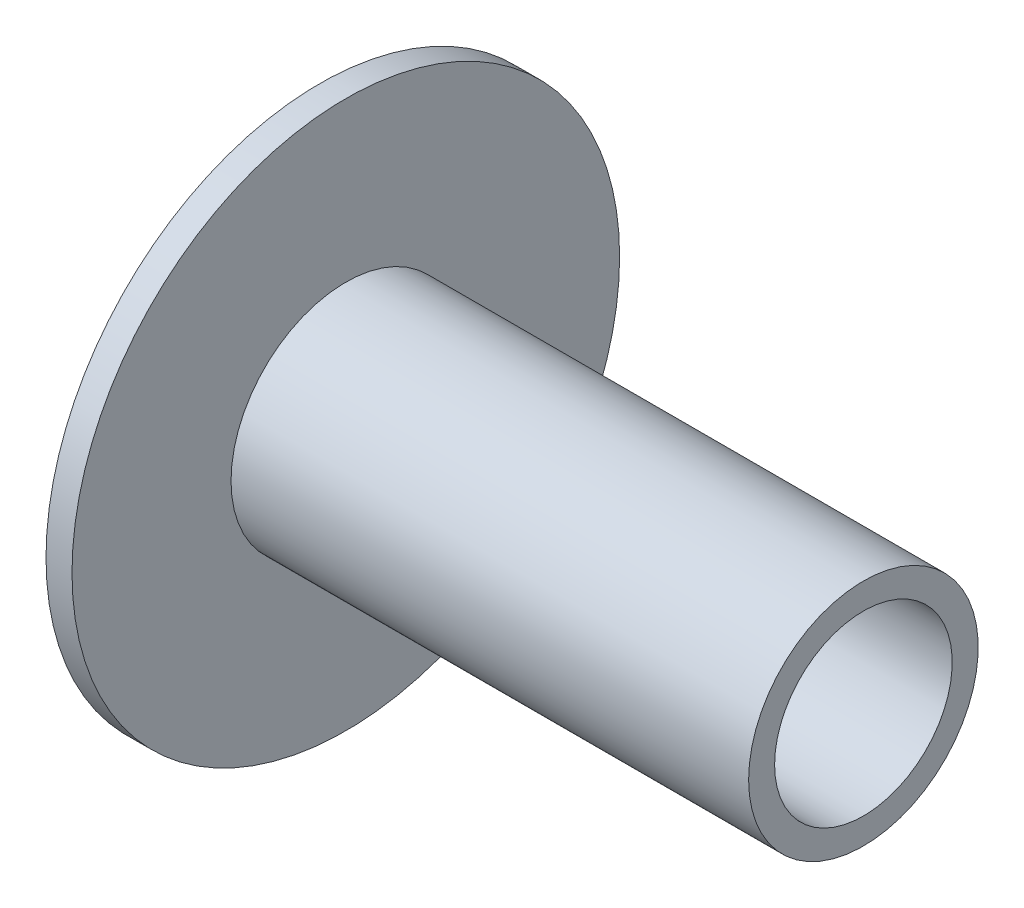
ISO-10303-21;
HEADER;
FILE_DESCRIPTION(('STEP AP214'),'2;1');
FILE_NAME('part.step','',(''),(''),'','','');
FILE_SCHEMA(('AUTOMOTIVE_DESIGN { 1 0 10303 214 1 1 1 1 }'));
ENDSEC;
DATA;
#1=APPLICATION_CONTEXT('core data for automotive mechanical design processes');
#2=APPLICATION_PROTOCOL_DEFINITION('international standard','automotive_design',2000,#1);
#3=PRODUCT_CONTEXT('',#1,'mechanical');
#4=PRODUCT('Part','Part','',(#3));
#5=PRODUCT_RELATED_PRODUCT_CATEGORY('part','',(#4));
#6=PRODUCT_DEFINITION_FORMATION('','',#4);
#7=PRODUCT_DEFINITION_CONTEXT('part definition',#1,'design');
#8=PRODUCT_DEFINITION('design','',#6,#7);
#9=PRODUCT_DEFINITION_SHAPE('','',#8);
#10=(LENGTH_UNIT() NAMED_UNIT(*) SI_UNIT(.MILLI.,.METRE.));
#11=(NAMED_UNIT(*) PLANE_ANGLE_UNIT() SI_UNIT($,.RADIAN.));
#12=(NAMED_UNIT(*) SI_UNIT($,.STERADIAN.) SOLID_ANGLE_UNIT());
#13=UNCERTAINTY_MEASURE_WITH_UNIT(LENGTH_MEASURE(1.E-05),#10,'distance_accuracy_value','');
#14=(GEOMETRIC_REPRESENTATION_CONTEXT(3) GLOBAL_UNCERTAINTY_ASSIGNED_CONTEXT((#13)) GLOBAL_UNIT_ASSIGNED_CONTEXT((#10,
#11,#12)) REPRESENTATION_CONTEXT('',''));
#15=CARTESIAN_POINT('',(0.,0.,0.));
#16=DIRECTION('',(0.,0.,1.));
#17=DIRECTION('',(1.,0.,0.));
#18=AXIS2_PLACEMENT_3D('',#15,#16,#17);
#19=CARTESIAN_POINT('',(0.,0.,0.));
#20=DIRECTION('',(-1.,0.,0.));
#21=DIRECTION('',(0.,0.,1.));
#22=AXIS2_PLACEMENT_3D('',#19,#20,#21);
#23=CYLINDRICAL_SURFACE('',#22,5.3);
#24=CARTESIAN_POINT('',(30.,0.,0.));
#25=DIRECTION('',(-1.,0.,0.));
#26=DIRECTION('',(0.,0.,1.));
#27=AXIS2_PLACEMENT_3D('',#24,#25,#26);
#28=CIRCLE('',#27,5.3);
#29=CARTESIAN_POINT('',(30.,0.,5.3));
#30=VERTEX_POINT('',#29);
#31=EDGE_CURVE('E68',#30,#30,#28,.T.);
#32=ORIENTED_EDGE('',*,*,#31,.T.);
#33=EDGE_LOOP('',(#32));
#34=FACE_BOUND('',#33,.T.);
#35=CARTESIAN_POINT('',(6.10294372515228,0.,0.));
#36=DIRECTION('',(-1.,0.,0.));
#37=DIRECTION('',(0.,0.,1.));
#38=AXIS2_PLACEMENT_3D('',#35,#36,#37);
#39=CIRCLE('',#38,5.3);
#40=CARTESIAN_POINT('',(6.10294372515228,0.,5.3));
#41=VERTEX_POINT('',#40);
#42=EDGE_CURVE('E11',#41,#41,#39,.T.);
#43=ORIENTED_EDGE('',*,*,#42,.F.);
#44=EDGE_LOOP('',(#43));
#45=FACE_BOUND('',#44,.T.);
#46=ADVANCED_FACE('F33',(#34,#45),#23,.T.);
#47=CARTESIAN_POINT('',(0.,0.,0.));
#48=DIRECTION('',(-1.,0.,0.));
#49=DIRECTION('',(0.,0.,1.));
#50=AXIS2_PLACEMENT_3D('',#47,#48,#49);
#51=CYLINDRICAL_SURFACE('',#50,3.7);
#52=CARTESIAN_POINT('',(0.,0.,0.));
#53=DIRECTION('',(-1.,0.,0.));
#54=DIRECTION('',(0.,0.,1.));
#55=AXIS2_PLACEMENT_3D('',#52,#53,#54);
#56=CIRCLE('',#55,3.7);
#57=CARTESIAN_POINT('',(0.,0.,3.7));
#58=VERTEX_POINT('',#57);
#59=EDGE_CURVE('E40',#58,#58,#56,.T.);
#60=ORIENTED_EDGE('',*,*,#59,.F.);
#61=EDGE_LOOP('',(#60));
#62=FACE_BOUND('',#61,.T.);
#63=CARTESIAN_POINT('',(0.599999999999997,0.,0.));
#64=DIRECTION('',(-1.,0.,0.));
#65=DIRECTION('',(0.,0.,1.));
#66=AXIS2_PLACEMENT_3D('',#63,#64,#65);
#67=CIRCLE('',#66,3.7);
#68=CARTESIAN_POINT('',(0.599999999999997,0.,3.7));
#69=VERTEX_POINT('',#68);
#70=EDGE_CURVE('E77',#69,#69,#67,.T.);
#71=ORIENTED_EDGE('',*,*,#70,.T.);
#72=EDGE_LOOP('',(#71));
#73=FACE_BOUND('',#72,.T.);
#74=ADVANCED_FACE('F35',(#62,#73),#51,.T.);
#75=CARTESIAN_POINT('',(0.,2.5,0.));
#76=DIRECTION('',(-1.,0.,0.));
#77=DIRECTION('',(0.,0.,1.));
#78=AXIS2_PLACEMENT_3D('',#75,#76,#77);
#79=PLANE('',#78);
#80=ORIENTED_EDGE('',*,*,#59,.T.);
#81=EDGE_LOOP('',(#80));
#82=FACE_BOUND('',#81,.T.);
#83=CARTESIAN_POINT('',(0.,0.,0.));
#84=DIRECTION('',(-1.,0.,0.));
#85=DIRECTION('',(0.,0.,1.));
#86=AXIS2_PLACEMENT_3D('',#83,#84,#85);
#87=CIRCLE('',#86,2.5);
#88=CARTESIAN_POINT('',(0.,0.,2.5));
#89=VERTEX_POINT('',#88);
#90=EDGE_CURVE('E44',#89,#89,#87,.T.);
#91=ORIENTED_EDGE('',*,*,#90,.F.);
#92=EDGE_LOOP('',(#91));
#93=FACE_BOUND('',#92,.T.);
#94=ADVANCED_FACE('F113',(#82,#93),#79,.T.);
#95=CARTESIAN_POINT('',(0.,0.,0.));
#96=DIRECTION('',(-1.,0.,0.));
#97=DIRECTION('',(0.,0.,1.));
#98=AXIS2_PLACEMENT_3D('',#95,#96,#97);
#99=CYLINDRICAL_SURFACE('',#98,2.5);
#100=ORIENTED_EDGE('',*,*,#90,.T.);
#101=EDGE_LOOP('',(#100));
#102=FACE_BOUND('',#101,.T.);
#103=CARTESIAN_POINT('',(1.2,0.,0.));
#104=DIRECTION('',(-1.,0.,0.));
#105=DIRECTION('',(0.,0.,1.));
#106=AXIS2_PLACEMENT_3D('',#103,#104,#105);
#107=CIRCLE('',#106,2.5);
#108=CARTESIAN_POINT('',(1.2,0.,2.5));
#109=VERTEX_POINT('',#108);
#110=EDGE_CURVE('E48',#109,#109,#107,.T.);
#111=ORIENTED_EDGE('',*,*,#110,.F.);
#112=EDGE_LOOP('',(#111));
#113=FACE_BOUND('',#112,.T.);
#114=ADVANCED_FACE('F143',(#102,#113),#99,.F.);
#115=CARTESIAN_POINT('',(1.8,0.,0.));
#116=DIRECTION('',(1.,0.,0.));
#117=DIRECTION('',(0.,0.,-1.));
#118=AXIS2_PLACEMENT_3D('',#115,#116,#117);
#119=CONICAL_SURFACE('',#118,3.1,0.78539816339745);
#120=ORIENTED_EDGE('',*,*,#110,.T.);
#121=EDGE_LOOP('',(#120));
#122=FACE_BOUND('',#121,.T.);
#123=CARTESIAN_POINT('',(1.8,0.,0.));
#124=DIRECTION('',(-1.,0.,0.));
#125=DIRECTION('',(0.,0.,1.));
#126=AXIS2_PLACEMENT_3D('',#123,#124,#125);
#127=CIRCLE('',#126,3.1);
#128=CARTESIAN_POINT('',(1.8,0.,3.1));
#129=VERTEX_POINT('',#128);
#130=EDGE_CURVE('E53',#129,#129,#127,.T.);
#131=ORIENTED_EDGE('',*,*,#130,.F.);
#132=EDGE_LOOP('',(#131));
#133=FACE_BOUND('',#132,.T.);
#134=ADVANCED_FACE('F139',(#122,#133),#119,.F.);
#135=CARTESIAN_POINT('',(1.8,3.5,0.));
#136=DIRECTION('',(1.,0.,0.));
#137=DIRECTION('',(0.,0.,-1.));
#138=AXIS2_PLACEMENT_3D('',#135,#136,#137);
#139=PLANE('',#138);
#140=ORIENTED_EDGE('',*,*,#130,.T.);
#141=EDGE_LOOP('',(#140));
#142=FACE_BOUND('',#141,.T.);
#143=CARTESIAN_POINT('',(1.8,0.,0.));
#144=DIRECTION('',(-1.,0.,0.));
#145=DIRECTION('',(0.,0.,1.));
#146=AXIS2_PLACEMENT_3D('',#143,#144,#145);
#147=CIRCLE('',#146,3.5);
#148=CARTESIAN_POINT('',(1.8,0.,3.5));
#149=VERTEX_POINT('',#148);
#150=EDGE_CURVE('E56',#149,#149,#147,.T.);
#151=ORIENTED_EDGE('',*,*,#150,.F.);
#152=EDGE_LOOP('',(#151));
#153=FACE_BOUND('',#152,.T.);
#154=ADVANCED_FACE('F135',(#142,#153),#139,.T.);
#155=CARTESIAN_POINT('',(0.,0.,0.));
#156=DIRECTION('',(-1.,0.,0.));
#157=DIRECTION('',(0.,0.,1.));
#158=AXIS2_PLACEMENT_3D('',#155,#156,#157);
#159=CYLINDRICAL_SURFACE('',#158,3.5);
#160=ORIENTED_EDGE('',*,*,#150,.T.);
#161=EDGE_LOOP('',(#160));
#162=FACE_BOUND('',#161,.T.);
#163=CARTESIAN_POINT('',(4.8,0.,0.));
#164=DIRECTION('',(-1.,0.,0.));
#165=DIRECTION('',(0.,0.,1.));
#166=AXIS2_PLACEMENT_3D('',#163,#164,#165);
#167=CIRCLE('',#166,3.5);
#168=CARTESIAN_POINT('',(4.8,0.,3.5));
#169=VERTEX_POINT('',#168);
#170=EDGE_CURVE('E59',#169,#169,#167,.T.);
#171=ORIENTED_EDGE('',*,*,#170,.F.);
#172=EDGE_LOOP('',(#171));
#173=FACE_BOUND('',#172,.T.);
#174=ADVANCED_FACE('F131',(#162,#173),#159,.F.);
#175=CARTESIAN_POINT('',(5.39999999999999,0.,0.));
#176=DIRECTION('',(1.,0.,0.));
#177=DIRECTION('',(0.,0.,-1.));
#178=AXIS2_PLACEMENT_3D('',#175,#176,#177);
#179=CONICAL_SURFACE('',#178,4.1,0.78539816339745);
#180=ORIENTED_EDGE('',*,*,#170,.T.);
#181=EDGE_LOOP('',(#180));
#182=FACE_BOUND('',#181,.T.);
#183=CARTESIAN_POINT('',(5.39999999999999,0.,0.));
#184=DIRECTION('',(-1.,0.,0.));
#185=DIRECTION('',(0.,0.,1.));
#186=AXIS2_PLACEMENT_3D('',#183,#184,#185);
#187=CIRCLE('',#186,4.1);
#188=CARTESIAN_POINT('',(5.39999999999999,0.,4.1));
#189=VERTEX_POINT('',#188);
#190=EDGE_CURVE('E62',#189,#189,#187,.T.);
#191=ORIENTED_EDGE('',*,*,#190,.F.);
#192=EDGE_LOOP('',(#191));
#193=FACE_BOUND('',#192,.T.);
#194=ADVANCED_FACE('F127',(#182,#193),#179,.F.);
#195=CARTESIAN_POINT('',(0.,0.,0.));
#196=DIRECTION('',(-1.,0.,0.));
#197=DIRECTION('',(0.,0.,1.));
#198=AXIS2_PLACEMENT_3D('',#195,#196,#197);
#199=CYLINDRICAL_SURFACE('',#198,4.1);
#200=ORIENTED_EDGE('',*,*,#190,.T.);
#201=EDGE_LOOP('',(#200));
#202=FACE_BOUND('',#201,.T.);
#203=CARTESIAN_POINT('',(30.,0.,0.));
#204=DIRECTION('',(-1.,0.,0.));
#205=DIRECTION('',(0.,0.,1.));
#206=AXIS2_PLACEMENT_3D('',#203,#204,#205);
#207=CIRCLE('',#206,4.1);
#208=CARTESIAN_POINT('',(30.,0.,4.1));
#209=VERTEX_POINT('',#208);
#210=EDGE_CURVE('E65',#209,#209,#207,.T.);
#211=ORIENTED_EDGE('',*,*,#210,.F.);
#212=EDGE_LOOP('',(#211));
#213=FACE_BOUND('',#212,.T.);
#214=ADVANCED_FACE('F123',(#202,#213),#199,.F.);
#215=CARTESIAN_POINT('',(30.,5.3,0.));
#216=DIRECTION('',(1.,0.,0.));
#217=DIRECTION('',(0.,0.,-1.));
#218=AXIS2_PLACEMENT_3D('',#215,#216,#217);
#219=PLANE('',#218);
#220=ORIENTED_EDGE('',*,*,#210,.T.);
#221=EDGE_LOOP('',(#220));
#222=FACE_BOUND('',#221,.T.);
#223=ORIENTED_EDGE('',*,*,#31,.F.);
#224=EDGE_LOOP('',(#223));
#225=FACE_BOUND('',#224,.T.);
#226=ADVANCED_FACE('F120',(#222,#225),#219,.T.);
#227=CARTESIAN_POINT('',(4.90294372515228,0.,0.));
#228=DIRECTION('',(1.,0.,0.));
#229=DIRECTION('',(0.,0.,-1.));
#230=AXIS2_PLACEMENT_3D('',#227,#228,#229);
#231=CONICAL_SURFACE('',#230,5.3,0.78539816339745);
#232=CARTESIAN_POINT('',(4.30294372515228,0.,0.));
#233=DIRECTION('',(-1.,0.,0.));
#234=DIRECTION('',(0.,0.,1.));
#235=AXIS2_PLACEMENT_3D('',#232,#233,#234);
#236=CIRCLE('',#235,4.7);
#237=CARTESIAN_POINT('',(4.30294372515228,0.,4.7));
#238=VERTEX_POINT('',#237);
#239=EDGE_CURVE('E71',#238,#238,#236,.T.);
#240=ORIENTED_EDGE('',*,*,#239,.F.);
#241=EDGE_LOOP('',(#240));
#242=FACE_BOUND('',#241,.T.);
#243=CARTESIAN_POINT('',(4.90294372515228,0.,0.));
#244=DIRECTION('',(-1.,0.,0.));
#245=DIRECTION('',(0.,0.,1.));
#246=AXIS2_PLACEMENT_3D('',#243,#244,#245);
#247=CIRCLE('',#246,5.3);
#248=CARTESIAN_POINT('',(4.90294372515228,0.,5.3));
#249=VERTEX_POINT('',#248);
#250=EDGE_CURVE('E80',#249,#249,#247,.T.);
#251=ORIENTED_EDGE('',*,*,#250,.T.);
#252=EDGE_LOOP('',(#251));
#253=FACE_BOUND('',#252,.T.);
#254=ADVANCED_FACE('F118',(#242,#253),#231,.T.);
#255=CARTESIAN_POINT('',(0.,0.,0.));
#256=DIRECTION('',(-1.,0.,0.));
#257=DIRECTION('',(0.,0.,1.));
#258=AXIS2_PLACEMENT_3D('',#255,#256,#257);
#259=CYLINDRICAL_SURFACE('',#258,4.7);
#260=CARTESIAN_POINT('',(0.599999999999997,0.,0.));
#261=DIRECTION('',(-1.,0.,0.));
#262=DIRECTION('',(0.,0.,1.));
#263=AXIS2_PLACEMENT_3D('',#260,#261,#262);
#264=CIRCLE('',#263,4.7);
#265=CARTESIAN_POINT('',(0.599999999999997,0.,4.7));
#266=VERTEX_POINT('',#265);
#267=EDGE_CURVE('E74',#266,#266,#264,.T.);
#268=ORIENTED_EDGE('',*,*,#267,.F.);
#269=EDGE_LOOP('',(#268));
#270=FACE_BOUND('',#269,.T.);
#271=ORIENTED_EDGE('',*,*,#239,.T.);
#272=EDGE_LOOP('',(#271));
#273=FACE_BOUND('',#272,.T.);
#274=ADVANCED_FACE('F104',(#270,#273),#259,.T.);
#275=CARTESIAN_POINT('',(0.599999999999997,3.5,0.));
#276=DIRECTION('',(1.,0.,0.));
#277=DIRECTION('',(0.,0.,-1.));
#278=AXIS2_PLACEMENT_3D('',#275,#276,#277);
#279=PLANE('',#278);
#280=ORIENTED_EDGE('',*,*,#70,.F.);
#281=EDGE_LOOP('',(#280));
#282=FACE_BOUND('',#281,.T.);
#283=ORIENTED_EDGE('',*,*,#267,.T.);
#284=EDGE_LOOP('',(#283));
#285=FACE_BOUND('',#284,.T.);
#286=ADVANCED_FACE('F96',(#282,#285),#279,.F.);
#287=CARTESIAN_POINT('',(6.10294372515228,5.3,0.));
#288=DIRECTION('',(-1.,0.,0.));
#289=DIRECTION('',(0.,0.,1.));
#290=AXIS2_PLACEMENT_3D('',#287,#288,#289);
#291=PLANE('',#290);
#292=CARTESIAN_POINT('',(6.10294372515228,0.,0.));
#293=DIRECTION('',(-1.,0.,0.));
#294=DIRECTION('',(0.,0.,1.));
#295=AXIS2_PLACEMENT_3D('',#292,#293,#294);
#296=CIRCLE('',#295,12.641985404537);
#297=CARTESIAN_POINT('',(6.10294372515228,0.,12.641985404537));
#298=VERTEX_POINT('',#297);
#299=EDGE_CURVE('E86',#298,#298,#296,.T.);
#300=ORIENTED_EDGE('',*,*,#299,.F.);
#301=EDGE_LOOP('',(#300));
#302=FACE_BOUND('',#301,.T.);
#303=ORIENTED_EDGE('',*,*,#42,.T.);
#304=EDGE_LOOP('',(#303));
#305=FACE_BOUND('',#304,.T.);
#306=ADVANCED_FACE('F93',(#302,#305),#291,.F.);
#307=CARTESIAN_POINT('',(4.90294372515228,5.3,0.));
#308=DIRECTION('',(-1.,0.,0.));
#309=DIRECTION('',(0.,0.,1.));
#310=AXIS2_PLACEMENT_3D('',#307,#308,#309);
#311=PLANE('',#310);
#312=CARTESIAN_POINT('',(4.90294372515228,0.,0.));
#313=DIRECTION('',(-1.,0.,0.));
#314=DIRECTION('',(0.,0.,1.));
#315=AXIS2_PLACEMENT_3D('',#312,#313,#314);
#316=CIRCLE('',#315,12.641985404537);
#317=CARTESIAN_POINT('',(4.90294372515228,0.,12.641985404537));
#318=VERTEX_POINT('',#317);
#319=EDGE_CURVE('E83',#318,#318,#316,.T.);
#320=ORIENTED_EDGE('',*,*,#319,.T.);
#321=EDGE_LOOP('',(#320));
#322=FACE_BOUND('',#321,.T.);
#323=ORIENTED_EDGE('',*,*,#250,.F.);
#324=EDGE_LOOP('',(#323));
#325=FACE_BOUND('',#324,.T.);
#326=ADVANCED_FACE('F95',(#322,#325),#311,.T.);
#327=CARTESIAN_POINT('',(0.,0.,0.));
#328=DIRECTION('',(-1.,0.,0.));
#329=DIRECTION('',(0.,0.,1.));
#330=AXIS2_PLACEMENT_3D('',#327,#328,#329);
#331=CYLINDRICAL_SURFACE('',#330,12.641985404537);
#332=ORIENTED_EDGE('',*,*,#299,.T.);
#333=EDGE_LOOP('',(#332));
#334=FACE_BOUND('',#333,.T.);
#335=ORIENTED_EDGE('',*,*,#319,.F.);
#336=EDGE_LOOP('',(#335));
#337=FACE_BOUND('',#336,.T.);
#338=ADVANCED_FACE('F90',(#334,#337),#331,.T.);
#339=CLOSED_SHELL('',(#46,#74,#94,#114,#134,#154,#174,#194,#214,#226,#254,#274,#286,#306,#326,#338));
#340=MANIFOLD_SOLID_BREP('B2',#339);
#341=ADVANCED_BREP_SHAPE_REPRESENTATION('',(#18,#340),#14);
#342=SHAPE_DEFINITION_REPRESENTATION(#9,#341);
ENDSEC;
END-ISO-10303-21;
